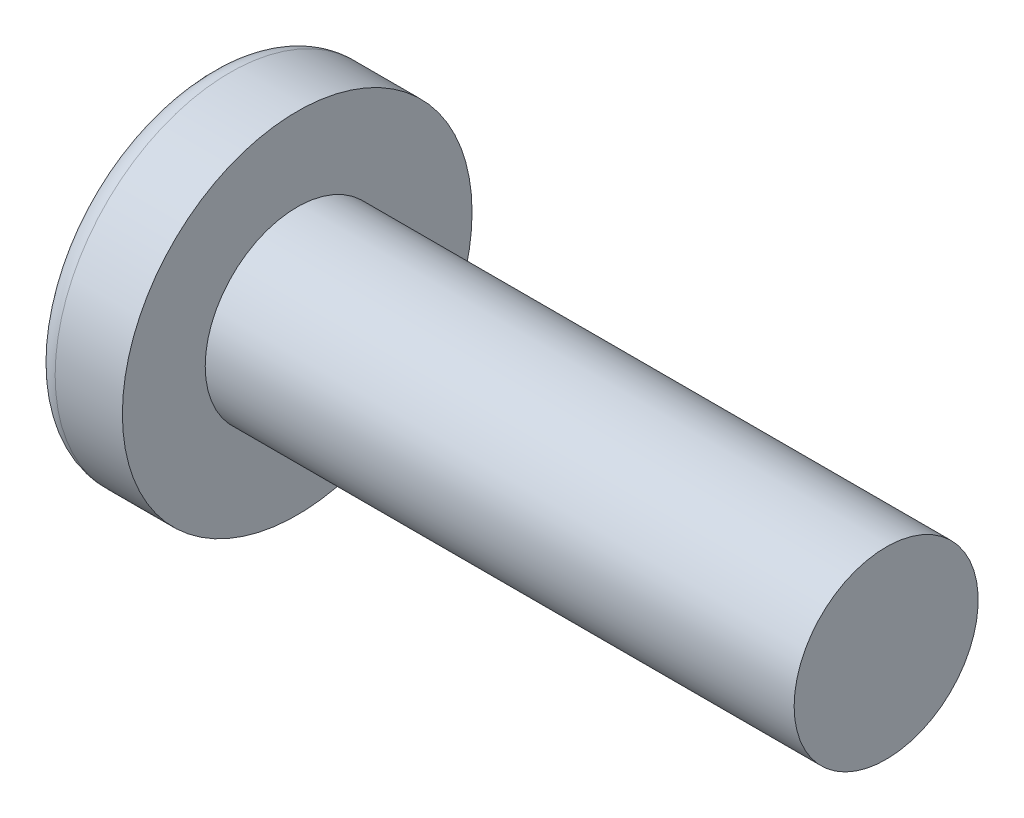
ISO-10303-21;
HEADER;
FILE_DESCRIPTION(('STEP AP214'),'2;1');
FILE_NAME('part.step','',(''),(''),'','','');
FILE_SCHEMA(('AUTOMOTIVE_DESIGN { 1 0 10303 214 1 1 1 1 }'));
ENDSEC;
DATA;
#1=APPLICATION_CONTEXT('core data for automotive mechanical design processes');
#2=APPLICATION_PROTOCOL_DEFINITION('international standard','automotive_design',2000,#1);
#3=PRODUCT_CONTEXT('',#1,'mechanical');
#4=PRODUCT('Part','Part','',(#3));
#5=PRODUCT_RELATED_PRODUCT_CATEGORY('part','',(#4));
#6=PRODUCT_DEFINITION_FORMATION('','',#4);
#7=PRODUCT_DEFINITION_CONTEXT('part definition',#1,'design');
#8=PRODUCT_DEFINITION('design','',#6,#7);
#9=PRODUCT_DEFINITION_SHAPE('','',#8);
#10=(LENGTH_UNIT() NAMED_UNIT(*) SI_UNIT(.MILLI.,.METRE.));
#11=(NAMED_UNIT(*) PLANE_ANGLE_UNIT() SI_UNIT($,.RADIAN.));
#12=(NAMED_UNIT(*) SI_UNIT($,.STERADIAN.) SOLID_ANGLE_UNIT());
#13=UNCERTAINTY_MEASURE_WITH_UNIT(LENGTH_MEASURE(1.E-05),#10,'distance_accuracy_value','');
#14=(GEOMETRIC_REPRESENTATION_CONTEXT(3) GLOBAL_UNCERTAINTY_ASSIGNED_CONTEXT((#13)) GLOBAL_UNIT_ASSIGNED_CONTEXT((#10,
#11,#12)) REPRESENTATION_CONTEXT('',''));
#15=CARTESIAN_POINT('',(0.,0.,0.));
#16=DIRECTION('',(0.,0.,1.));
#17=DIRECTION('',(1.,0.,0.));
#18=AXIS2_PLACEMENT_3D('',#15,#16,#17);
#19=CARTESIAN_POINT('',(8.,0.,0.));
#20=DIRECTION('',(-1.,0.,0.));
#21=DIRECTION('',(0.,1.,0.));
#22=AXIS2_PLACEMENT_3D('',#19,#20,#21);
#23=SPHERICAL_SURFACE('',#22,8.);
#24=CARTESIAN_POINT('',(1.37644815778014,0.,0.));
#25=DIRECTION('',(-1.,0.,0.));
#26=DIRECTION('',(0.,0.,1.));
#27=AXIS2_PLACEMENT_3D('',#24,#25,#26);
#28=CIRCLE('',#27,4.48648648648649);
#29=CARTESIAN_POINT('',(1.37644815778014,0.,4.48648648648649));
#30=VERTEX_POINT('',#29);
#31=EDGE_CURVE('E153',#30,#30,#28,.T.);
#32=ORIENTED_EDGE('',*,*,#31,.T.);
#33=EDGE_LOOP('',(#32));
#34=FACE_BOUND('',#33,.T.);
#35=CARTESIAN_POINT('',(7.98502567027952,-0.176697090701654,0.));
#36=DIRECTION('',(-0.0844430766861806,-0.996428304896931,0.));
#37=DIRECTION('',(0.996428304896931,-0.0844430766861806,0.));
#38=AXIS2_PLACEMENT_3D('',#35,#36,#37);
#39=CIRCLE('',#38,7.99803437774476);
#40=CARTESIAN_POINT('',(0.325131322777776,0.472446498069672,2.20752918301319));
#41=VERTEX_POINT('',#40);
#42=CARTESIAN_POINT('',(0.0309826509964153,0.497374351610472,0.497374351610473));
#43=VERTEX_POINT('',#42);
#44=EDGE_CURVE('E184',#41,#43,#39,.T.);
#45=ORIENTED_EDGE('',*,*,#44,.F.);
#46=CARTESIAN_POINT('',(6.31497138637622,0.,-2.25947018645006));
#47=DIRECTION('',(0.597823879730417,0.,0.801627475093059));
#48=DIRECTION('',(0.801627475093059,0.,-0.597823879730417));
#49=AXIS2_PLACEMENT_3D('',#46,#47,#48);
#50=CIRCLE('',#49,7.48702030502205);
#51=CARTESIAN_POINT('',(0.325131322777776,-0.472446498069688,2.20752918301319));
#52=VERTEX_POINT('',#51);
#53=EDGE_CURVE('E149',#41,#52,#50,.T.);
#54=ORIENTED_EDGE('',*,*,#53,.T.);
#55=CARTESIAN_POINT('',(7.98502567027952,0.176697090701654,0.));
#56=DIRECTION('',(-0.0844430766861806,0.996428304896931,0.));
#57=DIRECTION('',(-0.996428304896931,-0.0844430766861806,0.));
#58=AXIS2_PLACEMENT_3D('',#55,#56,#57);
#59=CIRCLE('',#58,7.99803437774476);
#60=CARTESIAN_POINT('',(0.0309826509964153,-0.497374351610475,0.497374351610473));
#61=VERTEX_POINT('',#60);
#62=EDGE_CURVE('E105',#61,#52,#59,.T.);
#63=ORIENTED_EDGE('',*,*,#62,.F.);
#64=CARTESIAN_POINT('',(7.98502567027952,0.,-0.176697090701654));
#65=DIRECTION('',(-0.0844430766861806,0.,-0.996428304896931));
#66=DIRECTION('',(-0.996428304896931,0.,0.0844430766861806));
#67=AXIS2_PLACEMENT_3D('',#64,#65,#66);
#68=CIRCLE('',#67,7.99803437774476);
#69=CARTESIAN_POINT('',(0.325131322777773,-2.20752918301318,0.47244649806968));
#70=VERTEX_POINT('',#69);
#71=EDGE_CURVE('E130',#70,#61,#68,.T.);
#72=ORIENTED_EDGE('',*,*,#71,.F.);
#73=CARTESIAN_POINT('',(6.31497138637622,2.25947018645007,0.));
#74=DIRECTION('',(0.597823879730417,-0.801627475093059,0.));
#75=DIRECTION('',(0.801627475093059,0.597823879730417,0.));
#76=AXIS2_PLACEMENT_3D('',#73,#74,#75);
#77=CIRCLE('',#76,7.48702030502205);
#78=CARTESIAN_POINT('',(0.325131322777775,-2.20752918301318,-0.47244649806968));
#79=VERTEX_POINT('',#78);
#80=EDGE_CURVE('E138',#70,#79,#77,.T.);
#81=ORIENTED_EDGE('',*,*,#80,.T.);
#82=CARTESIAN_POINT('',(7.98502567027952,0.,0.176697090701654));
#83=DIRECTION('',(-0.0844430766861806,0.,0.996428304896931));
#84=DIRECTION('',(0.996428304896931,0.,0.0844430766861806));
#85=AXIS2_PLACEMENT_3D('',#82,#83,#84);
#86=CIRCLE('',#85,7.99803437774476);
#87=CARTESIAN_POINT('',(0.0309826509964153,-0.497374351610471,-0.497374351610473));
#88=VERTEX_POINT('',#87);
#89=EDGE_CURVE('E48',#88,#79,#86,.T.);
#90=ORIENTED_EDGE('',*,*,#89,.F.);
#91=CARTESIAN_POINT('',(0.325131322777773,-0.472446498069672,-2.20752918301319));
#92=VERTEX_POINT('',#91);
#93=EDGE_CURVE('E191',#92,#88,#59,.T.);
#94=ORIENTED_EDGE('',*,*,#93,.F.);
#95=CARTESIAN_POINT('',(6.31497138637622,0.,2.25947018645006));
#96=DIRECTION('',(0.597823879730417,0.,-0.801627475093059));
#97=DIRECTION('',(-0.801627475093059,0.,-0.597823879730417));
#98=AXIS2_PLACEMENT_3D('',#95,#96,#97);
#99=CIRCLE('',#98,7.48702030502205);
#100=CARTESIAN_POINT('',(0.325131322777775,0.472446498069688,-2.20752918301318));
#101=VERTEX_POINT('',#100);
#102=EDGE_CURVE('E131',#92,#101,#99,.T.);
#103=ORIENTED_EDGE('',*,*,#102,.T.);
#104=CARTESIAN_POINT('',(0.0309826509964153,0.497374351610475,-0.497374351610473));
#105=VERTEX_POINT('',#104);
#106=EDGE_CURVE('E179',#105,#101,#39,.T.);
#107=ORIENTED_EDGE('',*,*,#106,.F.);
#108=CARTESIAN_POINT('',(0.325131322777776,2.20752918301319,-0.47244649806968));
#109=VERTEX_POINT('',#108);
#110=EDGE_CURVE('E41',#109,#105,#86,.T.);
#111=ORIENTED_EDGE('',*,*,#110,.F.);
#112=CARTESIAN_POINT('',(6.31497138637622,-2.25947018645006,0.));
#113=DIRECTION('',(0.597823879730417,0.801627475093059,0.));
#114=DIRECTION('',(-0.801627475093059,0.597823879730417,0.));
#115=AXIS2_PLACEMENT_3D('',#112,#113,#114);
#116=CIRCLE('',#115,7.48702030502205);
#117=CARTESIAN_POINT('',(0.325131322777776,2.20752918301319,0.47244649806968));
#118=VERTEX_POINT('',#117);
#119=EDGE_CURVE('E11',#109,#118,#116,.T.);
#120=ORIENTED_EDGE('',*,*,#119,.T.);
#121=EDGE_CURVE('E167',#43,#118,#68,.T.);
#122=ORIENTED_EDGE('',*,*,#121,.F.);
#123=EDGE_LOOP('',(#45,#54,#63,#72,#81,#90,#94,#103,#107,#111,#120,#122));
#124=FACE_BOUND('',#123,.T.);
#125=ADVANCED_FACE('F33',(#34,#124),#23,.T.);
#126=CARTESIAN_POINT('',(3.28522727272727,0.,-0.221590909090909));
#127=DIRECTION('',(-0.0844430766861806,0.,0.996428304896931));
#128=DIRECTION('',(0.996428304896931,0.,0.0844430766861806));
#129=AXIS2_PLACEMENT_3D('',#126,#127,#128);
#130=PLANE('',#129);
#131=ORIENTED_EDGE('',*,*,#110,.T.);
#132=DIRECTION('',(0.992894609445471,-0.0841436109699554,0.0841436109699551));
#133=VECTOR('',#132,1.);
#134=CARTESIAN_POINT('',(3.30374024870626,0.220022012821504,-0.220022012821503));
#135=LINE('',#134,#133);
#136=CARTESIAN_POINT('',(2.95,0.250000000000001,-0.249999999999999));
#137=VERTEX_POINT('',#136);
#138=EDGE_CURVE('E173',#105,#137,#135,.T.);
#139=ORIENTED_EDGE('',*,*,#138,.T.);
#140=DIRECTION('',(0.799784057588365,-0.596449127693018,0.0677783099651157));
#141=VECTOR('',#140,1.);
#142=CARTESIAN_POINT('',(0.,2.45,-0.5));
#143=LINE('',#142,#141);
#144=EDGE_CURVE('E154',#109,#137,#143,.T.);
#145=ORIENTED_EDGE('',*,*,#144,.F.);
#146=EDGE_LOOP('',(#131,#139,#145));
#147=FACE_BOUND('',#146,.T.);
#148=ADVANCED_FACE('F172',(#147),#130,.T.);
#149=DIRECTION('',(0.799784057588365,0.596449127693018,0.0677783099651157));
#150=VECTOR('',#149,1.);
#151=CARTESIAN_POINT('',(0.,-2.45,-0.5));
#152=LINE('',#151,#150);
#153=CARTESIAN_POINT('',(2.95,-0.25,-0.25));
#154=VERTEX_POINT('',#153);
#155=EDGE_CURVE('E139',#79,#154,#152,.T.);
#156=ORIENTED_EDGE('',*,*,#155,.T.);
#157=DIRECTION('',(-0.992894609445471,-0.0841436109699548,-0.0841436109699552));
#158=VECTOR('',#157,1.);
#159=CARTESIAN_POINT('',(3.30374024870626,-0.220022012821502,-0.220022012821503));
#160=LINE('',#159,#158);
#161=EDGE_CURVE('E194',#154,#88,#160,.T.);
#162=ORIENTED_EDGE('',*,*,#161,.T.);
#163=ORIENTED_EDGE('',*,*,#89,.T.);
#164=EDGE_LOOP('',(#156,#162,#163));
#165=FACE_BOUND('',#164,.T.);
#166=ADVANCED_FACE('F209',(#165),#130,.T.);
#167=CARTESIAN_POINT('',(3.28522727272727,0.,0.221590909090909));
#168=DIRECTION('',(-0.0844430766861806,0.,-0.996428304896931));
#169=DIRECTION('',(-0.996428304896931,0.,0.0844430766861806));
#170=AXIS2_PLACEMENT_3D('',#167,#168,#169);
#171=PLANE('',#170);
#172=DIRECTION('',(0.799784057588365,-0.596449127693018,-0.0677783099651158));
#173=VECTOR('',#172,1.);
#174=CARTESIAN_POINT('',(0.,2.45,0.5));
#175=LINE('',#174,#173);
#176=CARTESIAN_POINT('',(2.95,0.25,0.25));
#177=VERTEX_POINT('',#176);
#178=EDGE_CURVE('E210',#118,#177,#175,.T.);
#179=ORIENTED_EDGE('',*,*,#178,.T.);
#180=DIRECTION('',(-0.992894609445471,0.0841436109699549,0.0841436109699551));
#181=VECTOR('',#180,1.);
#182=CARTESIAN_POINT('',(3.30374024870626,0.220022012821502,0.220022012821503));
#183=LINE('',#182,#181);
#184=EDGE_CURVE('E188',#177,#43,#183,.T.);
#185=ORIENTED_EDGE('',*,*,#184,.T.);
#186=ORIENTED_EDGE('',*,*,#121,.T.);
#187=EDGE_LOOP('',(#179,#185,#186));
#188=FACE_BOUND('',#187,.T.);
#189=ADVANCED_FACE('F214',(#188),#171,.T.);
#190=ORIENTED_EDGE('',*,*,#71,.T.);
#191=DIRECTION('',(0.992894609445471,0.0841436109699554,-0.0841436109699551));
#192=VECTOR('',#191,1.);
#193=CARTESIAN_POINT('',(3.30374024870626,-0.220022012821504,0.220022012821503));
#194=LINE('',#193,#192);
#195=CARTESIAN_POINT('',(2.95,-0.250000000000001,0.249999999999999));
#196=VERTEX_POINT('',#195);
#197=EDGE_CURVE('E103',#61,#196,#194,.T.);
#198=ORIENTED_EDGE('',*,*,#197,.T.);
#199=DIRECTION('',(0.799784057588366,0.596449127693018,-0.0677783099651156));
#200=VECTOR('',#199,1.);
#201=CARTESIAN_POINT('',(0.,-2.45,0.5));
#202=LINE('',#201,#200);
#203=EDGE_CURVE('E128',#70,#196,#202,.T.);
#204=ORIENTED_EDGE('',*,*,#203,.F.);
#205=EDGE_LOOP('',(#190,#198,#204));
#206=FACE_BOUND('',#205,.T.);
#207=ADVANCED_FACE('F127',(#206),#171,.T.);
#208=CARTESIAN_POINT('',(-25.4,0.,0.));
#209=DIRECTION('',(-1.,0.,0.));
#210=DIRECTION('',(0.,0.,1.));
#211=AXIS2_PLACEMENT_3D('',#208,#209,#210);
#212=CYLINDRICAL_SURFACE('',#211,2.5);
#213=CARTESIAN_POINT('',(19.7,0.,0.));
#214=DIRECTION('',(-1.,0.,0.));
#215=DIRECTION('',(0.,0.,1.));
#216=AXIS2_PLACEMENT_3D('',#213,#214,#215);
#217=CIRCLE('',#216,2.5);
#218=CARTESIAN_POINT('',(19.7,0.,2.5));
#219=VERTEX_POINT('',#218);
#220=EDGE_CURVE('E150',#219,#219,#217,.T.);
#221=ORIENTED_EDGE('',*,*,#220,.T.);
#222=EDGE_LOOP('',(#221));
#223=FACE_BOUND('',#222,.T.);
#224=CARTESIAN_POINT('',(3.7,0.,0.));
#225=DIRECTION('',(-1.,0.,0.));
#226=DIRECTION('',(0.,0.,1.));
#227=AXIS2_PLACEMENT_3D('',#224,#225,#226);
#228=CIRCLE('',#227,2.5);
#229=CARTESIAN_POINT('',(3.7,0.,2.5));
#230=VERTEX_POINT('',#229);
#231=EDGE_CURVE('E163',#230,#230,#228,.T.);
#232=ORIENTED_EDGE('',*,*,#231,.F.);
#233=EDGE_LOOP('',(#232));
#234=FACE_BOUND('',#233,.T.);
#235=ADVANCED_FACE('F35',(#223,#234),#212,.T.);
#236=CARTESIAN_POINT('',(3.7,2.5,0.));
#237=DIRECTION('',(-1.,0.,0.));
#238=DIRECTION('',(0.,0.,1.));
#239=AXIS2_PLACEMENT_3D('',#236,#237,#238);
#240=PLANE('',#239);
#241=CARTESIAN_POINT('',(3.7,0.,0.));
#242=DIRECTION('',(-1.,0.,0.));
#243=DIRECTION('',(0.,0.,1.));
#244=AXIS2_PLACEMENT_3D('',#241,#242,#243);
#245=CIRCLE('',#244,4.75);
#246=CARTESIAN_POINT('',(3.7,0.,4.75));
#247=VERTEX_POINT('',#246);
#248=EDGE_CURVE('E160',#247,#247,#245,.T.);
#249=ORIENTED_EDGE('',*,*,#248,.F.);
#250=EDGE_LOOP('',(#249));
#251=FACE_BOUND('',#250,.T.);
#252=ORIENTED_EDGE('',*,*,#231,.T.);
#253=EDGE_LOOP('',(#252));
#254=FACE_BOUND('',#253,.T.);
#255=ADVANCED_FACE('F242',(#251,#254),#240,.F.);
#256=CARTESIAN_POINT('',(-25.4,0.,0.));
#257=DIRECTION('',(-1.,0.,0.));
#258=DIRECTION('',(0.,0.,1.));
#259=AXIS2_PLACEMENT_3D('',#256,#257,#258);
#260=CYLINDRICAL_SURFACE('',#259,4.75);
#261=ORIENTED_EDGE('',*,*,#248,.T.);
#262=EDGE_LOOP('',(#261));
#263=FACE_BOUND('',#262,.T.);
#264=CARTESIAN_POINT('',(1.87321454594663,0.,0.));
#265=DIRECTION('',(-1.,0.,0.));
#266=DIRECTION('',(0.,0.,1.));
#267=AXIS2_PLACEMENT_3D('',#264,#265,#266);
#268=CIRCLE('',#267,4.75);
#269=CARTESIAN_POINT('',(1.87321454594663,0.,4.75));
#270=VERTEX_POINT('',#269);
#271=EDGE_CURVE('E157',#270,#270,#268,.T.);
#272=ORIENTED_EDGE('',*,*,#271,.F.);
#273=EDGE_LOOP('',(#272));
#274=FACE_BOUND('',#273,.T.);
#275=ADVANCED_FACE('F239',(#263,#274),#260,.T.);
#276=CARTESIAN_POINT('',(1.87321454594663,0.,0.));
#277=DIRECTION('',(-1.,0.,0.));
#278=DIRECTION('',(0.,0.,1.));
#279=AXIS2_PLACEMENT_3D('',#276,#277,#278);
#280=TOROIDAL_SURFACE('',#279,4.15,0.599999999999999);
#281=ORIENTED_EDGE('',*,*,#271,.T.);
#282=EDGE_LOOP('',(#281));
#283=FACE_BOUND('',#282,.T.);
#284=ORIENTED_EDGE('',*,*,#31,.F.);
#285=EDGE_LOOP('',(#284));
#286=FACE_BOUND('',#285,.T.);
#287=ADVANCED_FACE('F236',(#283,#286),#280,.T.);
#288=CARTESIAN_POINT('',(19.7,2.5,0.));
#289=DIRECTION('',(1.,0.,0.));
#290=DIRECTION('',(0.,0.,-1.));
#291=AXIS2_PLACEMENT_3D('',#288,#289,#290);
#292=PLANE('',#291);
#293=ORIENTED_EDGE('',*,*,#220,.F.);
#294=EDGE_LOOP('',(#293));
#295=FACE_BOUND('',#294,.T.);
#296=ADVANCED_FACE('F234',(#295),#292,.T.);
#297=CARTESIAN_POINT('',(2.95,0.25,0.25));
#298=DIRECTION('',(0.597823879730417,0.801627475093059,0.));
#299=DIRECTION('',(-0.801627475093059,0.597823879730417,0.));
#300=AXIS2_PLACEMENT_3D('',#297,#298,#299);
#301=PLANE('',#300);
#302=ORIENTED_EDGE('',*,*,#144,.T.);
#303=DIRECTION('',(0.,0.,-1.));
#304=VECTOR('',#303,1.);
#305=CARTESIAN_POINT('',(2.95,0.25,0.25));
#306=LINE('',#305,#304);
#307=EDGE_CURVE('E121',#177,#137,#306,.T.);
#308=ORIENTED_EDGE('',*,*,#307,.F.);
#309=ORIENTED_EDGE('',*,*,#178,.F.);
#310=ORIENTED_EDGE('',*,*,#119,.F.);
#311=EDGE_LOOP('',(#302,#308,#309,#310));
#312=FACE_BOUND('',#311,.T.);
#313=ADVANCED_FACE('F213',(#312),#301,.F.);
#314=CARTESIAN_POINT('',(2.95,-0.25,-0.25));
#315=DIRECTION('',(0.597823879730417,-0.801627475093059,0.));
#316=DIRECTION('',(0.801627475093059,0.597823879730417,0.));
#317=AXIS2_PLACEMENT_3D('',#314,#315,#316);
#318=PLANE('',#317);
#319=ORIENTED_EDGE('',*,*,#203,.T.);
#320=DIRECTION('',(0.,0.,1.));
#321=VECTOR('',#320,1.);
#322=CARTESIAN_POINT('',(2.95,-0.25,-0.25));
#323=LINE('',#322,#321);
#324=EDGE_CURVE('E120',#154,#196,#323,.T.);
#325=ORIENTED_EDGE('',*,*,#324,.F.);
#326=ORIENTED_EDGE('',*,*,#155,.F.);
#327=ORIENTED_EDGE('',*,*,#80,.F.);
#328=EDGE_LOOP('',(#319,#325,#326,#327));
#329=FACE_BOUND('',#328,.T.);
#330=ADVANCED_FACE('F135',(#329),#318,.F.);
#331=CARTESIAN_POINT('',(2.95,0.25,-0.25));
#332=DIRECTION('',(-1.,0.,0.));
#333=DIRECTION('',(0.,0.,1.));
#334=AXIS2_PLACEMENT_3D('',#331,#332,#333);
#335=PLANE('',#334);
#336=DIRECTION('',(0.,1.,0.));
#337=VECTOR('',#336,1.);
#338=CARTESIAN_POINT('',(2.95,-0.25,-0.25));
#339=LINE('',#338,#337);
#340=EDGE_CURVE('E143',#154,#137,#339,.T.);
#341=ORIENTED_EDGE('',*,*,#340,.F.);
#342=ORIENTED_EDGE('',*,*,#324,.T.);
#343=DIRECTION('',(0.,-1.,0.));
#344=VECTOR('',#343,1.);
#345=CARTESIAN_POINT('',(2.95,0.25,0.25));
#346=LINE('',#345,#344);
#347=EDGE_CURVE('E112',#177,#196,#346,.T.);
#348=ORIENTED_EDGE('',*,*,#347,.F.);
#349=ORIENTED_EDGE('',*,*,#307,.T.);
#350=EDGE_LOOP('',(#341,#342,#348,#349));
#351=FACE_BOUND('',#350,.T.);
#352=ADVANCED_FACE('F141',(#351),#335,.T.);
#353=CARTESIAN_POINT('',(2.95,0.250000000000001,-0.249999999999999));
#354=DIRECTION('',(0.597823879730417,0.,-0.801627475093059));
#355=DIRECTION('',(0.801627475093059,0.,0.597823879730417));
#356=AXIS2_PLACEMENT_3D('',#353,#354,#355);
#357=PLANE('',#356);
#358=DIRECTION('',(0.799784057588366,0.0677783099651135,0.596449127693019));
#359=VECTOR('',#358,1.);
#360=CARTESIAN_POINT('',(0.,-0.499999999999991,-2.45));
#361=LINE('',#360,#359);
#362=EDGE_CURVE('E199',#92,#154,#361,.T.);
#363=ORIENTED_EDGE('',*,*,#362,.T.);
#364=ORIENTED_EDGE('',*,*,#340,.T.);
#365=DIRECTION('',(0.799784057588365,-0.0677783099651178,0.596449127693018));
#366=VECTOR('',#365,1.);
#367=CARTESIAN_POINT('',(0.,0.500000000000009,-2.45));
#368=LINE('',#367,#366);
#369=EDGE_CURVE('E109',#101,#137,#368,.T.);
#370=ORIENTED_EDGE('',*,*,#369,.F.);
#371=ORIENTED_EDGE('',*,*,#102,.F.);
#372=EDGE_LOOP('',(#363,#364,#370,#371));
#373=FACE_BOUND('',#372,.T.);
#374=ADVANCED_FACE('F204',(#373),#357,.F.);
#375=CARTESIAN_POINT('',(3.28522727272727,-0.221590909090909,0.));
#376=DIRECTION('',(-0.0844430766861806,0.996428304896931,0.));
#377=DIRECTION('',(-0.996428304896931,-0.0844430766861806,0.));
#378=AXIS2_PLACEMENT_3D('',#375,#376,#377);
#379=PLANE('',#378);
#380=ORIENTED_EDGE('',*,*,#93,.T.);
#381=ORIENTED_EDGE('',*,*,#161,.F.);
#382=ORIENTED_EDGE('',*,*,#362,.F.);
#383=EDGE_LOOP('',(#380,#381,#382));
#384=FACE_BOUND('',#383,.T.);
#385=ADVANCED_FACE('F208',(#384),#379,.T.);
#386=CARTESIAN_POINT('',(3.28522727272727,0.221590909090909,0.));
#387=DIRECTION('',(-0.0844430766861806,-0.996428304896931,0.));
#388=DIRECTION('',(0.996428304896931,-0.0844430766861806,0.));
#389=AXIS2_PLACEMENT_3D('',#386,#387,#388);
#390=PLANE('',#389);
#391=ORIENTED_EDGE('',*,*,#106,.T.);
#392=ORIENTED_EDGE('',*,*,#369,.T.);
#393=ORIENTED_EDGE('',*,*,#138,.F.);
#394=EDGE_LOOP('',(#391,#392,#393));
#395=FACE_BOUND('',#394,.T.);
#396=ADVANCED_FACE('F202',(#395),#390,.T.);
#397=CARTESIAN_POINT('',(2.95,-0.250000000000001,0.249999999999999));
#398=DIRECTION('',(0.597823879730417,0.,0.801627475093059));
#399=DIRECTION('',(-0.801627475093059,0.,0.597823879730417));
#400=AXIS2_PLACEMENT_3D('',#397,#398,#399);
#401=PLANE('',#400);
#402=DIRECTION('',(0.799784057588365,-0.0677783099651136,-0.596449127693019));
#403=VECTOR('',#402,1.);
#404=CARTESIAN_POINT('',(0.,0.499999999999991,2.45));
#405=LINE('',#404,#403);
#406=EDGE_CURVE('E108',#41,#177,#405,.T.);
#407=ORIENTED_EDGE('',*,*,#406,.T.);
#408=ORIENTED_EDGE('',*,*,#347,.T.);
#409=DIRECTION('',(0.799784057588365,0.0677783099651179,-0.596449127693018));
#410=VECTOR('',#409,1.);
#411=CARTESIAN_POINT('',(0.,-0.500000000000009,2.45));
#412=LINE('',#411,#410);
#413=EDGE_CURVE('E99',#52,#196,#412,.T.);
#414=ORIENTED_EDGE('',*,*,#413,.F.);
#415=ORIENTED_EDGE('',*,*,#53,.F.);
#416=EDGE_LOOP('',(#407,#408,#414,#415));
#417=FACE_BOUND('',#416,.T.);
#418=ADVANCED_FACE('F113',(#417),#401,.F.);
#419=ORIENTED_EDGE('',*,*,#44,.T.);
#420=ORIENTED_EDGE('',*,*,#184,.F.);
#421=ORIENTED_EDGE('',*,*,#406,.F.);
#422=EDGE_LOOP('',(#419,#420,#421));
#423=FACE_BOUND('',#422,.T.);
#424=ADVANCED_FACE('F215',(#423),#390,.T.);
#425=ORIENTED_EDGE('',*,*,#62,.T.);
#426=ORIENTED_EDGE('',*,*,#413,.T.);
#427=ORIENTED_EDGE('',*,*,#197,.F.);
#428=EDGE_LOOP('',(#425,#426,#427));
#429=FACE_BOUND('',#428,.T.);
#430=ADVANCED_FACE('F101',(#429),#379,.T.);
#431=CLOSED_SHELL('',(#125,#148,#166,#189,#207,#235,#255,#275,#287,#296,#313,#330,#352,#374,
#385,#396,#418,#424,#430));
#432=MANIFOLD_SOLID_BREP('B2',#431);
#433=ADVANCED_BREP_SHAPE_REPRESENTATION('',(#18,#432),#14);
#434=SHAPE_DEFINITION_REPRESENTATION(#9,#433);
ENDSEC;
END-ISO-10303-21;
